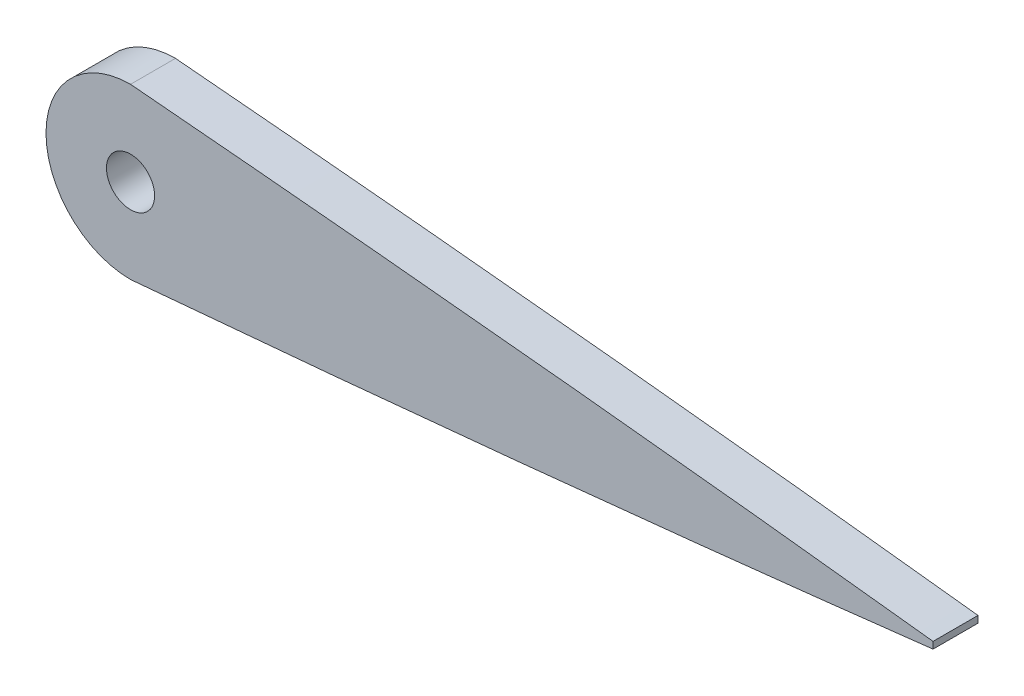
ISO-10303-21;
HEADER;
FILE_DESCRIPTION(('STEP AP214'),'2;1');
FILE_NAME('part.step','',(''),(''),'','','');
FILE_SCHEMA(('AUTOMOTIVE_DESIGN { 1 0 10303 214 1 1 1 1 }'));
ENDSEC;
DATA;
#1=APPLICATION_CONTEXT('core data for automotive mechanical design processes');
#2=APPLICATION_PROTOCOL_DEFINITION('international standard','automotive_design',2000,#1);
#3=PRODUCT_CONTEXT('',#1,'mechanical');
#4=PRODUCT('Part','Part','',(#3));
#5=PRODUCT_RELATED_PRODUCT_CATEGORY('part','',(#4));
#6=PRODUCT_DEFINITION_FORMATION('','',#4);
#7=PRODUCT_DEFINITION_CONTEXT('part definition',#1,'design');
#8=PRODUCT_DEFINITION('design','',#6,#7);
#9=PRODUCT_DEFINITION_SHAPE('','',#8);
#10=(LENGTH_UNIT() NAMED_UNIT(*) SI_UNIT(.MILLI.,.METRE.));
#11=(NAMED_UNIT(*) PLANE_ANGLE_UNIT() SI_UNIT($,.RADIAN.));
#12=(NAMED_UNIT(*) SI_UNIT($,.STERADIAN.) SOLID_ANGLE_UNIT());
#13=UNCERTAINTY_MEASURE_WITH_UNIT(LENGTH_MEASURE(1.E-05),#10,'distance_accuracy_value','');
#14=(GEOMETRIC_REPRESENTATION_CONTEXT(3) GLOBAL_UNCERTAINTY_ASSIGNED_CONTEXT((#13)) GLOBAL_UNIT_ASSIGNED_CONTEXT((#10,
#11,#12)) REPRESENTATION_CONTEXT('',''));
#15=CARTESIAN_POINT('',(0.,0.,0.));
#16=DIRECTION('',(0.,0.,1.));
#17=DIRECTION('',(1.,0.,0.));
#18=AXIS2_PLACEMENT_3D('',#15,#16,#17);
#19=CARTESIAN_POINT('',(149.999999999793,0.,1.4));
#20=DIRECTION('',(0.,0.,-1.));
#21=DIRECTION('',(-1.,0.,0.));
#22=AXIS2_PLACEMENT_3D('',#19,#20,#21);
#23=CYLINDRICAL_SURFACE('',#22,5.26718539787095);
#24=CARTESIAN_POINT('',(149.999999999793,0.,-1.4));
#25=DIRECTION('',(0.,0.,1.));
#26=DIRECTION('',(1.,0.,0.));
#27=AXIS2_PLACEMENT_3D('',#24,#25,#26);
#28=CIRCLE('',#27,5.26718539787095);
#29=CARTESIAN_POINT('',(149.999999999793,5.26718539787095,-1.4));
#30=VERTEX_POINT('',#29);
#31=CARTESIAN_POINT('',(149.999999999793,-5.26718539787095,-1.4));
#32=VERTEX_POINT('',#31);
#33=EDGE_CURVE('E136',#30,#32,#28,.T.);
#34=ORIENTED_EDGE('',*,*,#33,.T.);
#35=DIRECTION('',(0.,0.,-1.));
#36=VECTOR('',#35,1.);
#37=CARTESIAN_POINT('',(149.999999999793,-5.26718539787095,1.4));
#38=LINE('',#37,#36);
#39=CARTESIAN_POINT('',(149.999999999793,-5.26718539787095,1.4));
#40=VERTEX_POINT('',#39);
#41=EDGE_CURVE('E11',#40,#32,#38,.T.);
#42=ORIENTED_EDGE('',*,*,#41,.F.);
#43=CARTESIAN_POINT('',(149.999999999793,0.,1.4));
#44=DIRECTION('',(0.,0.,1.));
#45=DIRECTION('',(1.,0.,0.));
#46=AXIS2_PLACEMENT_3D('',#43,#44,#45);
#47=CIRCLE('',#46,5.26718539787095);
#48=CARTESIAN_POINT('',(149.999999999793,5.26718539787095,1.4));
#49=VERTEX_POINT('',#48);
#50=EDGE_CURVE('E90',#49,#40,#47,.T.);
#51=ORIENTED_EDGE('',*,*,#50,.F.);
#52=DIRECTION('',(0.,0.,-1.));
#53=VECTOR('',#52,1.);
#54=CARTESIAN_POINT('',(149.999999999793,5.26718539787095,1.4));
#55=LINE('',#54,#53);
#56=EDGE_CURVE('E105',#49,#30,#55,.T.);
#57=ORIENTED_EDGE('',*,*,#56,.T.);
#58=EDGE_LOOP('',(#34,#42,#51,#57));
#59=FACE_BOUND('',#58,.T.);
#60=ADVANCED_FACE('F41',(#59),#23,.T.);
#61=CARTESIAN_POINT('',(0.,0.,1.4));
#62=CARTESIAN_POINT('',(0.032444912785252,-0.278495811932672,1.4));
#63=CARTESIAN_POINT('',(0.100633197622265,-0.863800259371728,1.4));
#64=CARTESIAN_POINT('',(0.623792519502603,-1.67890559775423,1.4));
#65=CARTESIAN_POINT('',(1.40745451828777,-2.44535909768092,1.4));
#66=CARTESIAN_POINT('',(2.48215990999626,-3.17800751475483,1.4));
#67=CARTESIAN_POINT('',(3.83151572514316,-3.88154027980952,1.4));
#68=CARTESIAN_POINT('',(5.4563996703271,-4.55654172443833,1.4));
#69=CARTESIAN_POINT('',(7.35019505624769,-5.20163810131563,1.4));
#70=CARTESIAN_POINT('',(9.50742603844495,-5.81478546001263,1.4));
#71=CARTESIAN_POINT('',(11.9213051192179,-6.39387938375779,1.4));
#72=CARTESIAN_POINT('',(14.5848929101615,-6.93661243110209,1.4));
#73=CARTESIAN_POINT('',(17.4908774412382,-7.44078362046572,1.4));
#74=CARTESIAN_POINT('',(20.6317189277736,-7.90429451896973,1.4));
#75=CARTESIAN_POINT('',(23.999672571568,-8.32520507104545,1.4));
#76=CARTESIAN_POINT('',(27.5867798768591,-8.70174184542543,1.4));
#77=CARTESIAN_POINT('',(31.3848698966528,-9.03247593180038,1.4));
#78=CARTESIAN_POINT('',(35.3855806534432,-9.31609287396642,1.4));
#79=CARTESIAN_POINT('',(39.5803132923038,-9.55173595460592,1.4));
#80=CARTESIAN_POINT('',(43.9602634342418,-9.73880703158846,1.4));
#81=CARTESIAN_POINT('',(48.5163740297902,-9.87706597159685,1.4));
#82=CARTESIAN_POINT('',(53.2393408892924,-9.96650447988356,1.4));
#83=CARTESIAN_POINT('',(58.1195804749707,-10.007674079145,1.4));
#84=CARTESIAN_POINT('',(63.1472322990156,-10.001179646896,1.4));
#85=CARTESIAN_POINT('',(68.3121128519377,-9.94818077935783,1.4));
#86=CARTESIAN_POINT('',(73.6037062020649,-9.8499841929222,1.4));
#87=CARTESIAN_POINT('',(79.0111217778761,-9.70818550815225,1.4));
#88=CARTESIAN_POINT('',(84.523090509599,-9.52465705063052,1.4));
#89=CARTESIAN_POINT('',(90.1278825022712,-9.30143328572871,1.4));
#90=CARTESIAN_POINT('',(95.8133076165863,-9.04071110478476,1.4));
#91=CARTESIAN_POINT('',(101.566628902932,-8.7448298081215,1.4));
#92=CARTESIAN_POINT('',(107.374551667041,-8.41626692508818,1.4));
#93=CARTESIAN_POINT('',(113.22310934854,-8.05749764662533,1.4));
#94=CARTESIAN_POINT('',(119.097620697921,-7.67114629363284,1.4));
#95=CARTESIAN_POINT('',(124.982562689731,-7.25984067879183,1.4));
#96=CARTESIAN_POINT('',(130.861479372453,-6.82616997050118,1.4));
#97=CARTESIAN_POINT('',(136.716836604175,-6.37289207616603,1.4));
#98=CARTESIAN_POINT('',(142.529855650017,-5.90276600308212,1.4));
#99=CARTESIAN_POINT('',(148.280267016593,-5.41860205745455,1.4));
#100=CARTESIAN_POINT('',(153.946093309733,-4.92342664586893,1.4));
#101=CARTESIAN_POINT('',(159.503224244657,-4.42043747597675,1.4));
#102=CARTESIAN_POINT('',(164.924982484319,-3.91321825677237,1.4));
#103=CARTESIAN_POINT('',(170.181418839819,-3.40569757505764,1.4));
#104=CARTESIAN_POINT('',(175.238405484524,-2.90257427967232,1.4));
#105=CARTESIAN_POINT('',(180.056168680252,-2.40924306336166,1.4));
#106=CARTESIAN_POINT('',(184.587045719794,-1.9324791813071,1.4));
#107=CARTESIAN_POINT('',(188.771568450786,-1.48069518196539,1.4));
#108=CARTESIAN_POINT('',(192.53078468655,-1.06506384171922,1.4));
#109=CARTESIAN_POINT('',(195.747560943775,-0.701689978749802,1.4));
#110=CARTESIAN_POINT('',(198.179524953216,-0.422303953934671,1.4));
#111=CARTESIAN_POINT('',(199.520051416084,-0.265971644451139,1.4));
#112=CARTESIAN_POINT('',(200.,-0.21,1.4));
#113=B_SPLINE_CURVE_WITH_KNOTS('',3,(#61,#62,#63,#64,#65,#66,#67,#68,#69,#70,#71,#72,#73,#74,
#75,#76,#77,#78,#79,#80,#81,#82,#83,#84,#85,#86,#87,#88,#89,#90,#91,#92,#93,#94,#95,#96,#97,#98,
#99,#100,#101,#102,#103,#104,#105,#106,#107,#108,#109,#110,#111,#112),.UNSPECIFIED.,.F.,.F.,(4,
1,1,1,1,1,1,1,1,1,1,1,1,1,1,1,1,1,1,1,1,1,1,1,1,1,1,1,1,1,1,1,1,1,1,1,1,1,1,1,1,1,1,1,1,1,1,1,1,
4),(0.,0.00409901119627068,0.00861474169622246,0.013934854724959,0.0202777746115639,
0.0277529807018305,0.0364102145151919,0.0462664329749759,0.057320237837208,0.0695589461393541,
0.0829628608595683,0.0975072182865541,0.113164081930894,0.129902689855954,0.147690303906216,
0.166492184642367,0.186271967143026,0.206991861424857,0.228612214931178,0.25109216492606,
0.274388983443375,0.298458209116087,0.323253842050884,0.348727970896163,0.374830386774719,
0.401509190431855,0.428710015672103,0.456376153594157,0.484448082863221,0.512863886613239,
0.541558094079446,0.570462312854758,0.599504247573885,0.628607348748546,0.657690446050344,
0.68666723740018,0.715444848929875,0.743923546361862,0.771994829811623,0.799540252867686,
0.826428321931678,0.852512114582347,0.877624445997917,0.901571133904992,0.924121062493777,
0.944988816236939,0.963803938777258,0.980044339265456,0.992855276358985,1.),.UNSPECIFIED.);
#114=DIRECTION('',(0.,0.,-1.));
#115=VECTOR('',#114,1.);
#116=SURFACE_OF_LINEAR_EXTRUSION('',#113,#115);
#117=CARTESIAN_POINT('',(0.,0.,-1.4));
#118=CARTESIAN_POINT('',(0.032444912785252,-0.278495811932672,-1.4));
#119=CARTESIAN_POINT('',(0.100633197622265,-0.863800259371728,-1.4));
#120=CARTESIAN_POINT('',(0.623792519502603,-1.67890559775423,-1.4));
#121=CARTESIAN_POINT('',(1.40745451828777,-2.44535909768092,-1.4));
#122=CARTESIAN_POINT('',(2.48215990999626,-3.17800751475483,-1.4));
#123=CARTESIAN_POINT('',(3.83151572514316,-3.88154027980952,-1.4));
#124=CARTESIAN_POINT('',(5.4563996703271,-4.55654172443833,-1.4));
#125=CARTESIAN_POINT('',(7.35019505624769,-5.20163810131563,-1.4));
#126=CARTESIAN_POINT('',(9.50742603844495,-5.81478546001263,-1.4));
#127=CARTESIAN_POINT('',(11.9213051192179,-6.39387938375779,-1.4));
#128=CARTESIAN_POINT('',(14.5848929101615,-6.93661243110209,-1.4));
#129=CARTESIAN_POINT('',(17.4908774412382,-7.44078362046572,-1.4));
#130=CARTESIAN_POINT('',(20.6317189277736,-7.90429451896973,-1.4));
#131=CARTESIAN_POINT('',(23.999672571568,-8.32520507104545,-1.4));
#132=CARTESIAN_POINT('',(27.5867798768591,-8.70174184542543,-1.4));
#133=CARTESIAN_POINT('',(31.3848698966528,-9.03247593180038,-1.4));
#134=CARTESIAN_POINT('',(35.3855806534432,-9.31609287396642,-1.4));
#135=CARTESIAN_POINT('',(39.5803132923038,-9.55173595460592,-1.4));
#136=CARTESIAN_POINT('',(43.9602634342418,-9.73880703158846,-1.4));
#137=CARTESIAN_POINT('',(48.5163740297902,-9.87706597159685,-1.4));
#138=CARTESIAN_POINT('',(53.2393408892924,-9.96650447988356,-1.4));
#139=CARTESIAN_POINT('',(58.1195804749707,-10.007674079145,-1.4));
#140=CARTESIAN_POINT('',(63.1472322990156,-10.001179646896,-1.4));
#141=CARTESIAN_POINT('',(68.3121128519377,-9.94818077935783,-1.4));
#142=CARTESIAN_POINT('',(73.6037062020649,-9.8499841929222,-1.4));
#143=CARTESIAN_POINT('',(79.0111217778761,-9.70818550815225,-1.4));
#144=CARTESIAN_POINT('',(84.523090509599,-9.52465705063052,-1.4));
#145=CARTESIAN_POINT('',(90.1278825022712,-9.30143328572871,-1.4));
#146=CARTESIAN_POINT('',(95.8133076165863,-9.04071110478476,-1.4));
#147=CARTESIAN_POINT('',(101.566628902932,-8.7448298081215,-1.4));
#148=CARTESIAN_POINT('',(107.374551667041,-8.41626692508818,-1.4));
#149=CARTESIAN_POINT('',(113.22310934854,-8.05749764662533,-1.4));
#150=CARTESIAN_POINT('',(119.097620697921,-7.67114629363284,-1.4));
#151=CARTESIAN_POINT('',(124.982562689731,-7.25984067879183,-1.4));
#152=CARTESIAN_POINT('',(130.861479372453,-6.82616997050118,-1.4));
#153=CARTESIAN_POINT('',(136.716836604175,-6.37289207616603,-1.4));
#154=CARTESIAN_POINT('',(142.529855650017,-5.90276600308212,-1.4));
#155=CARTESIAN_POINT('',(148.280267016593,-5.41860205745455,-1.4));
#156=CARTESIAN_POINT('',(153.946093309733,-4.92342664586893,-1.4));
#157=CARTESIAN_POINT('',(159.503224244657,-4.42043747597675,-1.4));
#158=CARTESIAN_POINT('',(164.924982484319,-3.91321825677237,-1.4));
#159=CARTESIAN_POINT('',(170.181418839819,-3.40569757505764,-1.4));
#160=CARTESIAN_POINT('',(175.238405484524,-2.90257427967232,-1.4));
#161=CARTESIAN_POINT('',(180.056168680252,-2.40924306336166,-1.4));
#162=CARTESIAN_POINT('',(184.587045719794,-1.9324791813071,-1.4));
#163=CARTESIAN_POINT('',(188.771568450786,-1.48069518196539,-1.4));
#164=CARTESIAN_POINT('',(192.53078468655,-1.06506384171922,-1.4));
#165=CARTESIAN_POINT('',(195.747560943775,-0.701689978749802,-1.4));
#166=CARTESIAN_POINT('',(198.179524953216,-0.422303953934671,-1.4));
#167=CARTESIAN_POINT('',(199.520051416084,-0.265971644451139,-1.4));
#168=CARTESIAN_POINT('',(200.,-0.21,-1.4));
#169=B_SPLINE_CURVE_WITH_KNOTS('',3,(#117,#118,#119,#120,#121,#122,#123,#124,#125,#126,#127,
#128,#129,#130,#131,#132,#133,#134,#135,#136,#137,#138,#139,#140,#141,#142,#143,#144,#145,#146,
#147,#148,#149,#150,#151,#152,#153,#154,#155,#156,#157,#158,#159,#160,#161,#162,#163,#164,#165,
#166,#167,#168),.UNSPECIFIED.,.F.,.F.,(4,1,1,1,1,1,1,1,1,1,1,1,1,1,1,1,1,1,1,1,1,1,1,1,1,1,1,1,
1,1,1,1,1,1,1,1,1,1,1,1,1,1,1,1,1,1,1,1,1,4),(0.,0.00409901119627068,0.00861474169622246,
0.013934854724959,0.0202777746115639,0.0277529807018305,0.0364102145151919,0.0462664329749759,
0.057320237837208,0.0695589461393541,0.0829628608595683,0.0975072182865541,0.113164081930894,
0.129902689855954,0.147690303906216,0.166492184642367,0.186271967143026,0.206991861424857,
0.228612214931178,0.25109216492606,0.274388983443375,0.298458209116087,0.323253842050884,
0.348727970896163,0.374830386774719,0.401509190431855,0.428710015672103,0.456376153594157,
0.484448082863221,0.512863886613239,0.541558094079446,0.570462312854758,0.599504247573885,
0.628607348748546,0.657690446050344,0.68666723740018,0.715444848929875,0.743923546361862,
0.771994829811623,0.799540252867686,0.826428321931678,0.852512114582347,0.877624445997917,
0.901571133904992,0.924121062493777,0.944988816236939,0.963803938777258,0.980044339265456,
0.992855276358985,1.),.UNSPECIFIED.);
#170=CARTESIAN_POINT('',(200.,-0.21,-1.4));
#171=VERTEX_POINT('',#170);
#172=EDGE_CURVE('E96',#32,#171,#169,.T.);
#173=ORIENTED_EDGE('',*,*,#172,.T.);
#174=DIRECTION('',(0.,0.,-1.));
#175=VECTOR('',#174,1.);
#176=CARTESIAN_POINT('',(200.,-0.21,1.4));
#177=LINE('',#176,#175);
#178=CARTESIAN_POINT('',(200.,-0.21,1.4));
#179=VERTEX_POINT('',#178);
#180=EDGE_CURVE('E51',#179,#171,#177,.T.);
#181=ORIENTED_EDGE('',*,*,#180,.F.);
#182=EDGE_CURVE('E85',#40,#179,#113,.T.);
#183=ORIENTED_EDGE('',*,*,#182,.F.);
#184=ORIENTED_EDGE('',*,*,#41,.T.);
#185=EDGE_LOOP('',(#173,#181,#183,#184));
#186=FACE_BOUND('',#185,.T.);
#187=ADVANCED_FACE('F95',(#186),#116,.F.);
#188=CARTESIAN_POINT('',(200.,0.,1.4));
#189=DIRECTION('',(1.,0.,0.));
#190=DIRECTION('',(0.,0.,-1.));
#191=AXIS2_PLACEMENT_3D('',#188,#189,#190);
#192=PLANE('',#191);
#193=DIRECTION('',(0.,-1.,0.));
#194=VECTOR('',#193,1.);
#195=CARTESIAN_POINT('',(200.,0.,-1.4));
#196=LINE('',#195,#194);
#197=CARTESIAN_POINT('',(200.,0.21,-1.4));
#198=VERTEX_POINT('',#197);
#199=EDGE_CURVE('E141',#198,#171,#196,.T.);
#200=ORIENTED_EDGE('',*,*,#199,.F.);
#201=DIRECTION('',(0.,0.,-1.));
#202=VECTOR('',#201,1.);
#203=CARTESIAN_POINT('',(200.,0.21,1.4));
#204=LINE('',#203,#202);
#205=CARTESIAN_POINT('',(200.,0.21,1.4));
#206=VERTEX_POINT('',#205);
#207=EDGE_CURVE('E75',#206,#198,#204,.T.);
#208=ORIENTED_EDGE('',*,*,#207,.F.);
#209=DIRECTION('',(0.,-1.,0.));
#210=VECTOR('',#209,1.);
#211=CARTESIAN_POINT('',(200.,0.,1.4));
#212=LINE('',#211,#210);
#213=EDGE_CURVE('E88',#206,#179,#212,.T.);
#214=ORIENTED_EDGE('',*,*,#213,.T.);
#215=ORIENTED_EDGE('',*,*,#180,.T.);
#216=EDGE_LOOP('',(#200,#208,#214,#215));
#217=FACE_BOUND('',#216,.T.);
#218=ADVANCED_FACE('F101',(#217),#192,.T.);
#219=CARTESIAN_POINT('',(149.999999999793,0.,1.4));
#220=DIRECTION('',(0.,0.,-1.));
#221=DIRECTION('',(-1.,0.,0.));
#222=AXIS2_PLACEMENT_3D('',#219,#220,#221);
#223=CYLINDRICAL_SURFACE('',#222,1.5);
#224=CARTESIAN_POINT('',(149.999999999793,0.,1.4));
#225=DIRECTION('',(0.,0.,1.));
#226=DIRECTION('',(1.,0.,0.));
#227=AXIS2_PLACEMENT_3D('',#224,#225,#226);
#228=CIRCLE('',#227,1.5);
#229=CARTESIAN_POINT('',(151.499999999793,0.,1.4));
#230=VERTEX_POINT('',#229);
#231=EDGE_CURVE('E156',#230,#230,#228,.T.);
#232=ORIENTED_EDGE('',*,*,#231,.T.);
#233=EDGE_LOOP('',(#232));
#234=FACE_BOUND('',#233,.T.);
#235=CARTESIAN_POINT('',(149.999999999793,0.,-1.4));
#236=DIRECTION('',(0.,0.,1.));
#237=DIRECTION('',(1.,0.,0.));
#238=AXIS2_PLACEMENT_3D('',#235,#236,#237);
#239=CIRCLE('',#238,1.5);
#240=CARTESIAN_POINT('',(151.499999999793,0.,-1.4));
#241=VERTEX_POINT('',#240);
#242=EDGE_CURVE('E115',#241,#241,#239,.T.);
#243=ORIENTED_EDGE('',*,*,#242,.F.);
#244=EDGE_LOOP('',(#243));
#245=FACE_BOUND('',#244,.T.);
#246=ADVANCED_FACE('F43',(#234,#245),#223,.F.);
#247=CARTESIAN_POINT('',(200.,0.21,1.4));
#248=CARTESIAN_POINT('',(199.520051416084,0.265971644451139,1.4));
#249=CARTESIAN_POINT('',(198.179524953216,0.42230395393467,1.4));
#250=CARTESIAN_POINT('',(195.747560943775,0.701689978749802,1.4));
#251=CARTESIAN_POINT('',(192.53078468655,1.06506384171923,1.4));
#252=CARTESIAN_POINT('',(188.771568450786,1.48069518196539,1.4));
#253=CARTESIAN_POINT('',(184.587045719794,1.9324791813071,1.4));
#254=CARTESIAN_POINT('',(180.056168680252,2.40924306336166,1.4));
#255=CARTESIAN_POINT('',(175.238405484524,2.90257427967232,1.4));
#256=CARTESIAN_POINT('',(170.181418839819,3.40569757505764,1.4));
#257=CARTESIAN_POINT('',(164.924982484319,3.91321825677237,1.4));
#258=CARTESIAN_POINT('',(159.503224244657,4.42043747597675,1.4));
#259=CARTESIAN_POINT('',(153.946093309733,4.92342664586893,1.4));
#260=CARTESIAN_POINT('',(148.280267016593,5.41860205745455,1.4));
#261=CARTESIAN_POINT('',(142.529855650017,5.90276600308212,1.4));
#262=CARTESIAN_POINT('',(136.716836604175,6.37289207616603,1.4));
#263=CARTESIAN_POINT('',(130.861479372453,6.82616997050118,1.4));
#264=CARTESIAN_POINT('',(124.982562689731,7.25984067879183,1.4));
#265=CARTESIAN_POINT('',(119.097620697921,7.67114629363284,1.4));
#266=CARTESIAN_POINT('',(113.22310934854,8.05749764662533,1.4));
#267=CARTESIAN_POINT('',(107.374551667041,8.41626692508818,1.4));
#268=CARTESIAN_POINT('',(101.566628902932,8.74482980812151,1.4));
#269=CARTESIAN_POINT('',(95.8133076165863,9.04071110478476,1.4));
#270=CARTESIAN_POINT('',(90.1278825022712,9.30143328572872,1.4));
#271=CARTESIAN_POINT('',(84.5230905095989,9.52465705063052,1.4));
#272=CARTESIAN_POINT('',(79.011121777876,9.70818550815226,1.4));
#273=CARTESIAN_POINT('',(73.603706202065,9.8499841929222,1.4));
#274=CARTESIAN_POINT('',(68.3121128519377,9.94818077935784,1.4));
#275=CARTESIAN_POINT('',(63.1472322990156,10.001179646896,1.4));
#276=CARTESIAN_POINT('',(58.1195804749707,10.007674079145,1.4));
#277=CARTESIAN_POINT('',(53.2393408892924,9.96650447988356,1.4));
#278=CARTESIAN_POINT('',(48.5163740297902,9.87706597159685,1.4));
#279=CARTESIAN_POINT('',(43.9602634342419,9.73880703158846,1.4));
#280=CARTESIAN_POINT('',(39.5803132923038,9.55173595460593,1.4));
#281=CARTESIAN_POINT('',(35.3855806534432,9.31609287396642,1.4));
#282=CARTESIAN_POINT('',(31.3848698966529,9.03247593180038,1.4));
#283=CARTESIAN_POINT('',(27.5867798768591,8.70174184542543,1.4));
#284=CARTESIAN_POINT('',(23.999672571568,8.32520507104544,1.4));
#285=CARTESIAN_POINT('',(20.6317189277736,7.90429451896974,1.4));
#286=CARTESIAN_POINT('',(17.4908774412382,7.44078362046572,1.4));
#287=CARTESIAN_POINT('',(14.5848929101615,6.93661243110209,1.4));
#288=CARTESIAN_POINT('',(11.9213051192179,6.39387938375778,1.4));
#289=CARTESIAN_POINT('',(9.50742603844498,5.81478546001263,1.4));
#290=CARTESIAN_POINT('',(7.35019505624767,5.20163810131563,1.4));
#291=CARTESIAN_POINT('',(5.4563996703271,4.55654172443833,1.4));
#292=CARTESIAN_POINT('',(3.83151572514316,3.88154027980952,1.4));
#293=CARTESIAN_POINT('',(2.48215990999627,3.17800751475484,1.4));
#294=CARTESIAN_POINT('',(1.40745451828776,2.44535909768091,1.4));
#295=CARTESIAN_POINT('',(0.623792519502604,1.67890559775423,1.4));
#296=CARTESIAN_POINT('',(0.100633197622267,0.863800259371733,1.4));
#297=CARTESIAN_POINT('',(0.0324449127852523,0.278495811932672,1.4));
#298=CARTESIAN_POINT('',(0.,0.,1.4));
#299=B_SPLINE_CURVE_WITH_KNOTS('',3,(#247,#248,#249,#250,#251,#252,#253,#254,#255,#256,#257,
#258,#259,#260,#261,#262,#263,#264,#265,#266,#267,#268,#269,#270,#271,#272,#273,#274,#275,#276,
#277,#278,#279,#280,#281,#282,#283,#284,#285,#286,#287,#288,#289,#290,#291,#292,#293,#294,#295,
#296,#297,#298),.UNSPECIFIED.,.F.,.F.,(4,1,1,1,1,1,1,1,1,1,1,1,1,1,1,1,1,1,1,1,1,1,1,1,1,1,1,1,
1,1,1,1,1,1,1,1,1,1,1,1,1,1,1,1,1,1,1,1,1,4),(0.,0.00714472364101506,0.0199556607345444,
0.0361960612227424,0.0550111837630615,0.075878937506223,0.0984288660950082,0.122375554002083,
0.147487885417653,0.173571678068322,0.200459747132314,0.228005170188377,0.256076453638138,
0.284555151070125,0.31333276259982,0.342309553949656,0.371392651251454,0.400495752426115,
0.429537687145242,0.458441905920554,0.487136113386761,0.515551917136779,0.543623846405843,
0.571289984327897,0.598490809568145,0.625169613225281,0.651272029103836,0.676746157949116,
0.701541790883912,0.725611016556625,0.74890783507394,0.771387785068822,0.793008138575142,
0.813728032856974,0.833507815357633,0.852309696093784,0.870097310144046,0.886835918069106,
0.902492781713446,0.917037139140432,0.930441053860646,0.942679762162792,0.953733567025024,
0.963589785484808,0.972247019298169,0.979722225388436,0.986065145275041,0.991385258303777,
0.995900988803729,1.),.UNSPECIFIED.);
#300=DIRECTION('',(0.,0.,-1.));
#301=VECTOR('',#300,1.);
#302=SURFACE_OF_LINEAR_EXTRUSION('',#299,#301);
#303=CARTESIAN_POINT('',(200.,0.21,-1.4));
#304=CARTESIAN_POINT('',(199.520051416084,0.265971644451139,-1.4));
#305=CARTESIAN_POINT('',(198.179524953216,0.42230395393467,-1.4));
#306=CARTESIAN_POINT('',(195.747560943775,0.701689978749802,-1.4));
#307=CARTESIAN_POINT('',(192.53078468655,1.06506384171923,-1.4));
#308=CARTESIAN_POINT('',(188.771568450786,1.48069518196539,-1.4));
#309=CARTESIAN_POINT('',(184.587045719794,1.9324791813071,-1.4));
#310=CARTESIAN_POINT('',(180.056168680252,2.40924306336166,-1.4));
#311=CARTESIAN_POINT('',(175.238405484524,2.90257427967232,-1.4));
#312=CARTESIAN_POINT('',(170.181418839819,3.40569757505764,-1.4));
#313=CARTESIAN_POINT('',(164.924982484319,3.91321825677237,-1.4));
#314=CARTESIAN_POINT('',(159.503224244657,4.42043747597675,-1.4));
#315=CARTESIAN_POINT('',(153.946093309733,4.92342664586893,-1.4));
#316=CARTESIAN_POINT('',(148.280267016593,5.41860205745455,-1.4));
#317=CARTESIAN_POINT('',(142.529855650017,5.90276600308212,-1.4));
#318=CARTESIAN_POINT('',(136.716836604175,6.37289207616603,-1.4));
#319=CARTESIAN_POINT('',(130.861479372453,6.82616997050118,-1.4));
#320=CARTESIAN_POINT('',(124.982562689731,7.25984067879183,-1.4));
#321=CARTESIAN_POINT('',(119.097620697921,7.67114629363284,-1.4));
#322=CARTESIAN_POINT('',(113.22310934854,8.05749764662533,-1.4));
#323=CARTESIAN_POINT('',(107.374551667041,8.41626692508818,-1.4));
#324=CARTESIAN_POINT('',(101.566628902932,8.74482980812151,-1.4));
#325=CARTESIAN_POINT('',(95.8133076165863,9.04071110478476,-1.4));
#326=CARTESIAN_POINT('',(90.1278825022712,9.30143328572872,-1.4));
#327=CARTESIAN_POINT('',(84.5230905095989,9.52465705063052,-1.4));
#328=CARTESIAN_POINT('',(79.011121777876,9.70818550815226,-1.4));
#329=CARTESIAN_POINT('',(73.603706202065,9.8499841929222,-1.4));
#330=CARTESIAN_POINT('',(68.3121128519377,9.94818077935784,-1.4));
#331=CARTESIAN_POINT('',(63.1472322990156,10.001179646896,-1.4));
#332=CARTESIAN_POINT('',(58.1195804749707,10.007674079145,-1.4));
#333=CARTESIAN_POINT('',(53.2393408892924,9.96650447988356,-1.4));
#334=CARTESIAN_POINT('',(48.5163740297902,9.87706597159685,-1.4));
#335=CARTESIAN_POINT('',(43.9602634342419,9.73880703158846,-1.4));
#336=CARTESIAN_POINT('',(39.5803132923038,9.55173595460593,-1.4));
#337=CARTESIAN_POINT('',(35.3855806534432,9.31609287396642,-1.4));
#338=CARTESIAN_POINT('',(31.3848698966529,9.03247593180038,-1.4));
#339=CARTESIAN_POINT('',(27.5867798768591,8.70174184542543,-1.4));
#340=CARTESIAN_POINT('',(23.999672571568,8.32520507104544,-1.4));
#341=CARTESIAN_POINT('',(20.6317189277736,7.90429451896974,-1.4));
#342=CARTESIAN_POINT('',(17.4908774412382,7.44078362046572,-1.4));
#343=CARTESIAN_POINT('',(14.5848929101615,6.93661243110209,-1.4));
#344=CARTESIAN_POINT('',(11.9213051192179,6.39387938375778,-1.4));
#345=CARTESIAN_POINT('',(9.50742603844498,5.81478546001263,-1.4));
#346=CARTESIAN_POINT('',(7.35019505624767,5.20163810131563,-1.4));
#347=CARTESIAN_POINT('',(5.4563996703271,4.55654172443833,-1.4));
#348=CARTESIAN_POINT('',(3.83151572514316,3.88154027980952,-1.4));
#349=CARTESIAN_POINT('',(2.48215990999627,3.17800751475484,-1.4));
#350=CARTESIAN_POINT('',(1.40745451828776,2.44535909768091,-1.4));
#351=CARTESIAN_POINT('',(0.623792519502604,1.67890559775423,-1.4));
#352=CARTESIAN_POINT('',(0.100633197622267,0.863800259371733,-1.4));
#353=CARTESIAN_POINT('',(0.0324449127852523,0.278495811932672,-1.4));
#354=CARTESIAN_POINT('',(0.,0.,-1.4));
#355=B_SPLINE_CURVE_WITH_KNOTS('',3,(#303,#304,#305,#306,#307,#308,#309,#310,#311,#312,#313,
#314,#315,#316,#317,#318,#319,#320,#321,#322,#323,#324,#325,#326,#327,#328,#329,#330,#331,#332,
#333,#334,#335,#336,#337,#338,#339,#340,#341,#342,#343,#344,#345,#346,#347,#348,#349,#350,#351,
#352,#353,#354),.UNSPECIFIED.,.F.,.F.,(4,1,1,1,1,1,1,1,1,1,1,1,1,1,1,1,1,1,1,1,1,1,1,1,1,1,1,1,
1,1,1,1,1,1,1,1,1,1,1,1,1,1,1,1,1,1,1,1,1,4),(0.,0.00714472364101506,0.0199556607345444,
0.0361960612227424,0.0550111837630615,0.075878937506223,0.0984288660950082,0.122375554002083,
0.147487885417653,0.173571678068322,0.200459747132314,0.228005170188377,0.256076453638138,
0.284555151070125,0.31333276259982,0.342309553949656,0.371392651251454,0.400495752426115,
0.429537687145242,0.458441905920554,0.487136113386761,0.515551917136779,0.543623846405843,
0.571289984327897,0.598490809568145,0.625169613225281,0.651272029103836,0.676746157949116,
0.701541790883912,0.725611016556625,0.74890783507394,0.771387785068822,0.793008138575142,
0.813728032856974,0.833507815357633,0.852309696093784,0.870097310144046,0.886835918069106,
0.902492781713446,0.917037139140432,0.930441053860646,0.942679762162792,0.953733567025024,
0.963589785484808,0.972247019298169,0.979722225388436,0.986065145275041,0.991385258303777,
0.995900988803729,1.),.UNSPECIFIED.);
#356=EDGE_CURVE('E78',#198,#30,#355,.T.);
#357=ORIENTED_EDGE('',*,*,#356,.T.);
#358=ORIENTED_EDGE('',*,*,#56,.F.);
#359=EDGE_CURVE('E59',#206,#49,#299,.T.);
#360=ORIENTED_EDGE('',*,*,#359,.F.);
#361=ORIENTED_EDGE('',*,*,#207,.T.);
#362=EDGE_LOOP('',(#357,#358,#360,#361));
#363=FACE_BOUND('',#362,.T.);
#364=ADVANCED_FACE('F121',(#363),#302,.F.);
#365=CARTESIAN_POINT('',(0.,0.,1.4));
#366=DIRECTION('',(0.,0.,1.));
#367=DIRECTION('',(1.,0.,0.));
#368=AXIS2_PLACEMENT_3D('',#365,#366,#367);
#369=PLANE('',#368);
#370=ORIENTED_EDGE('',*,*,#231,.F.);
#371=EDGE_LOOP('',(#370));
#372=FACE_BOUND('',#371,.T.);
#373=ORIENTED_EDGE('',*,*,#50,.T.);
#374=ORIENTED_EDGE('',*,*,#182,.T.);
#375=ORIENTED_EDGE('',*,*,#213,.F.);
#376=ORIENTED_EDGE('',*,*,#359,.T.);
#377=EDGE_LOOP('',(#373,#374,#375,#376));
#378=FACE_BOUND('',#377,.T.);
#379=ADVANCED_FACE('F86',(#372,#378),#369,.T.);
#380=CARTESIAN_POINT('',(0.,0.,-1.4));
#381=DIRECTION('',(0.,0.,1.));
#382=DIRECTION('',(1.,0.,0.));
#383=AXIS2_PLACEMENT_3D('',#380,#381,#382);
#384=PLANE('',#383);
#385=ORIENTED_EDGE('',*,*,#242,.T.);
#386=EDGE_LOOP('',(#385));
#387=FACE_BOUND('',#386,.T.);
#388=ORIENTED_EDGE('',*,*,#33,.F.);
#389=ORIENTED_EDGE('',*,*,#356,.F.);
#390=ORIENTED_EDGE('',*,*,#199,.T.);
#391=ORIENTED_EDGE('',*,*,#172,.F.);
#392=EDGE_LOOP('',(#388,#389,#390,#391));
#393=FACE_BOUND('',#392,.T.);
#394=ADVANCED_FACE('F125',(#387,#393),#384,.F.);
#395=CLOSED_SHELL('',(#60,#187,#218,#246,#364,#379,#394));
#396=MANIFOLD_SOLID_BREP('B2',#395);
#397=ADVANCED_BREP_SHAPE_REPRESENTATION('',(#18,#396),#14);
#398=SHAPE_DEFINITION_REPRESENTATION(#9,#397);
ENDSEC;
END-ISO-10303-21;
